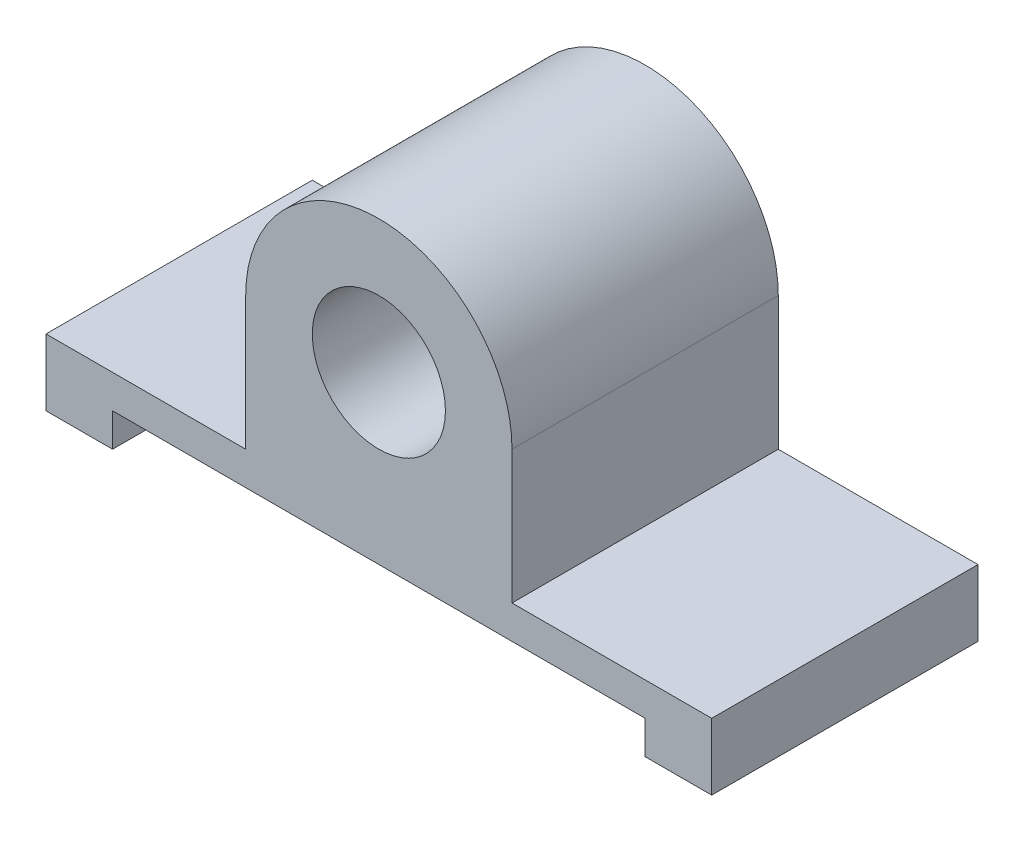
ISO-10303-21;
HEADER;
FILE_DESCRIPTION(('STEP AP214'),'2;1');
FILE_NAME('part.step','',(''),(''),'','','');
FILE_SCHEMA(('AUTOMOTIVE_DESIGN { 1 0 10303 214 1 1 1 1 }'));
ENDSEC;
DATA;
#1=APPLICATION_CONTEXT('core data for automotive mechanical design processes');
#2=APPLICATION_PROTOCOL_DEFINITION('international standard','automotive_design',2000,#1);
#3=PRODUCT_CONTEXT('',#1,'mechanical');
#4=PRODUCT('Part','Part','',(#3));
#5=PRODUCT_RELATED_PRODUCT_CATEGORY('part','',(#4));
#6=PRODUCT_DEFINITION_FORMATION('','',#4);
#7=PRODUCT_DEFINITION_CONTEXT('part definition',#1,'design');
#8=PRODUCT_DEFINITION('design','',#6,#7);
#9=PRODUCT_DEFINITION_SHAPE('','',#8);
#10=(LENGTH_UNIT() NAMED_UNIT(*) SI_UNIT(.MILLI.,.METRE.));
#11=(NAMED_UNIT(*) PLANE_ANGLE_UNIT() SI_UNIT($,.RADIAN.));
#12=(NAMED_UNIT(*) SI_UNIT($,.STERADIAN.) SOLID_ANGLE_UNIT());
#13=UNCERTAINTY_MEASURE_WITH_UNIT(LENGTH_MEASURE(1.E-05),#10,'distance_accuracy_value','');
#14=(GEOMETRIC_REPRESENTATION_CONTEXT(3) GLOBAL_UNCERTAINTY_ASSIGNED_CONTEXT((#13)) GLOBAL_UNIT_ASSIGNED_CONTEXT((#10,
#11,#12)) REPRESENTATION_CONTEXT('',''));
#15=CARTESIAN_POINT('',(0.,0.,0.));
#16=DIRECTION('',(0.,0.,1.));
#17=DIRECTION('',(1.,0.,0.));
#18=AXIS2_PLACEMENT_3D('',#15,#16,#17);
#19=CARTESIAN_POINT('',(0.,30.,20.));
#20=DIRECTION('',(0.,0.,-1.));
#21=DIRECTION('',(-1.,0.,0.));
#22=AXIS2_PLACEMENT_3D('',#19,#20,#21);
#23=PLANE('',#22);
#24=DIRECTION('',(1.,0.,0.));
#25=VECTOR('',#24,1.);
#26=CARTESIAN_POINT('',(40.,0.,20.));
#27=LINE('',#26,#25);
#28=CARTESIAN_POINT('',(40.,0.,20.));
#29=VERTEX_POINT('',#28);
#30=CARTESIAN_POINT('',(50.,0.,20.));
#31=VERTEX_POINT('',#30);
#32=EDGE_CURVE('E183',#29,#31,#27,.T.);
#33=ORIENTED_EDGE('',*,*,#32,.T.);
#34=DIRECTION('',(0.,1.,0.));
#35=VECTOR('',#34,1.);
#36=CARTESIAN_POINT('',(50.,0.,20.));
#37=LINE('',#36,#35);
#38=CARTESIAN_POINT('',(50.,10.,20.));
#39=VERTEX_POINT('',#38);
#40=EDGE_CURVE('E112',#31,#39,#37,.T.);
#41=ORIENTED_EDGE('',*,*,#40,.T.);
#42=DIRECTION('',(-1.,0.,0.));
#43=VECTOR('',#42,1.);
#44=CARTESIAN_POINT('',(50.,10.,20.));
#45=LINE('',#44,#43);
#46=CARTESIAN_POINT('',(20.,10.,20.));
#47=VERTEX_POINT('',#46);
#48=EDGE_CURVE('E210',#39,#47,#45,.T.);
#49=ORIENTED_EDGE('',*,*,#48,.T.);
#50=DIRECTION('',(0.,1.,0.));
#51=VECTOR('',#50,1.);
#52=CARTESIAN_POINT('',(20.,30.,20.));
#53=LINE('',#52,#51);
#54=CARTESIAN_POINT('',(20.,30.,20.));
#55=VERTEX_POINT('',#54);
#56=EDGE_CURVE('E227',#47,#55,#53,.T.);
#57=ORIENTED_EDGE('',*,*,#56,.T.);
#58=CARTESIAN_POINT('',(0.,30.,20.));
#59=DIRECTION('',(0.,0.,1.));
#60=DIRECTION('',(-1.,0.,0.));
#61=AXIS2_PLACEMENT_3D('',#58,#59,#60);
#62=CIRCLE('',#61,20.);
#63=CARTESIAN_POINT('',(-20.,30.,20.));
#64=VERTEX_POINT('',#63);
#65=EDGE_CURVE('E226',#55,#64,#62,.T.);
#66=ORIENTED_EDGE('',*,*,#65,.T.);
#67=DIRECTION('',(0.,-1.,0.));
#68=VECTOR('',#67,1.);
#69=CARTESIAN_POINT('',(-20.,10.,20.));
#70=LINE('',#69,#68);
#71=CARTESIAN_POINT('',(-20.,10.,20.));
#72=VERTEX_POINT('',#71);
#73=EDGE_CURVE('E228',#64,#72,#70,.T.);
#74=ORIENTED_EDGE('',*,*,#73,.T.);
#75=DIRECTION('',(-1.,0.,0.));
#76=VECTOR('',#75,1.);
#77=CARTESIAN_POINT('',(-20.,10.,20.));
#78=LINE('',#77,#76);
#79=CARTESIAN_POINT('',(-50.,10.,20.));
#80=VERTEX_POINT('',#79);
#81=EDGE_CURVE('E231',#72,#80,#78,.T.);
#82=ORIENTED_EDGE('',*,*,#81,.T.);
#83=DIRECTION('',(0.,-1.,0.));
#84=VECTOR('',#83,1.);
#85=CARTESIAN_POINT('',(-50.,10.,20.));
#86=LINE('',#85,#84);
#87=CARTESIAN_POINT('',(-50.,0.,20.));
#88=VERTEX_POINT('',#87);
#89=EDGE_CURVE('E240',#80,#88,#86,.T.);
#90=ORIENTED_EDGE('',*,*,#89,.T.);
#91=DIRECTION('',(1.,0.,0.));
#92=VECTOR('',#91,1.);
#93=CARTESIAN_POINT('',(-50.,0.,20.));
#94=LINE('',#93,#92);
#95=CARTESIAN_POINT('',(-40.,0.,20.));
#96=VERTEX_POINT('',#95);
#97=EDGE_CURVE('E145',#88,#96,#94,.T.);
#98=ORIENTED_EDGE('',*,*,#97,.T.);
#99=DIRECTION('',(0.,1.,0.));
#100=VECTOR('',#99,1.);
#101=CARTESIAN_POINT('',(-40.,0.,20.));
#102=LINE('',#101,#100);
#103=CARTESIAN_POINT('',(-40.,5.00000000000001,20.));
#104=VERTEX_POINT('',#103);
#105=EDGE_CURVE('E136',#96,#104,#102,.T.);
#106=ORIENTED_EDGE('',*,*,#105,.T.);
#107=DIRECTION('',(1.,0.,0.));
#108=VECTOR('',#107,1.);
#109=CARTESIAN_POINT('',(-40.,5.00000000000001,20.));
#110=LINE('',#109,#108);
#111=CARTESIAN_POINT('',(40.,5.00000000000001,20.));
#112=VERTEX_POINT('',#111);
#113=EDGE_CURVE('E139',#104,#112,#110,.T.);
#114=ORIENTED_EDGE('',*,*,#113,.T.);
#115=DIRECTION('',(0.,-1.,0.));
#116=VECTOR('',#115,1.);
#117=CARTESIAN_POINT('',(40.,5.00000000000001,20.));
#118=LINE('',#117,#116);
#119=EDGE_CURVE('E57',#112,#29,#118,.T.);
#120=ORIENTED_EDGE('',*,*,#119,.T.);
#121=EDGE_LOOP('',(#33,#41,#49,#57,#66,#74,#82,#90,#98,#106,#114,#120));
#122=FACE_BOUND('',#121,.T.);
#123=CARTESIAN_POINT('',(0.,30.,20.));
#124=DIRECTION('',(0.,0.,1.));
#125=DIRECTION('',(1.,0.,0.));
#126=AXIS2_PLACEMENT_3D('',#123,#124,#125);
#127=CIRCLE('',#126,10.);
#128=CARTESIAN_POINT('',(9.99999999999999,30.,20.));
#129=VERTEX_POINT('',#128);
#130=EDGE_CURVE('E163',#129,#129,#127,.T.);
#131=ORIENTED_EDGE('',*,*,#130,.F.);
#132=EDGE_LOOP('',(#131));
#133=FACE_BOUND('',#132,.T.);
#134=ADVANCED_FACE('F39',(#122,#133),#23,.F.);
#135=CARTESIAN_POINT('',(0.,30.,-20.));
#136=DIRECTION('',(0.,0.,-1.));
#137=DIRECTION('',(-1.,0.,0.));
#138=AXIS2_PLACEMENT_3D('',#135,#136,#137);
#139=PLANE('',#138);
#140=DIRECTION('',(1.,0.,0.));
#141=VECTOR('',#140,1.);
#142=CARTESIAN_POINT('',(40.,0.,-20.));
#143=LINE('',#142,#141);
#144=CARTESIAN_POINT('',(40.,0.,-20.));
#145=VERTEX_POINT('',#144);
#146=CARTESIAN_POINT('',(50.,0.,-20.));
#147=VERTEX_POINT('',#146);
#148=EDGE_CURVE('E158',#145,#147,#143,.T.);
#149=ORIENTED_EDGE('',*,*,#148,.F.);
#150=DIRECTION('',(0.,-1.,0.));
#151=VECTOR('',#150,1.);
#152=CARTESIAN_POINT('',(40.,5.00000000000001,-20.));
#153=LINE('',#152,#151);
#154=CARTESIAN_POINT('',(40.,5.00000000000001,-20.));
#155=VERTEX_POINT('',#154);
#156=EDGE_CURVE('E104',#155,#145,#153,.T.);
#157=ORIENTED_EDGE('',*,*,#156,.F.);
#158=DIRECTION('',(1.,0.,0.));
#159=VECTOR('',#158,1.);
#160=CARTESIAN_POINT('',(-40.,5.00000000000001,-20.));
#161=LINE('',#160,#159);
#162=CARTESIAN_POINT('',(-40.,5.00000000000001,-20.));
#163=VERTEX_POINT('',#162);
#164=EDGE_CURVE('E100',#163,#155,#161,.T.);
#165=ORIENTED_EDGE('',*,*,#164,.F.);
#166=DIRECTION('',(0.,1.,0.));
#167=VECTOR('',#166,1.);
#168=CARTESIAN_POINT('',(-40.,0.,-20.));
#169=LINE('',#168,#167);
#170=CARTESIAN_POINT('',(-40.,0.,-20.));
#171=VERTEX_POINT('',#170);
#172=EDGE_CURVE('E148',#171,#163,#169,.T.);
#173=ORIENTED_EDGE('',*,*,#172,.F.);
#174=DIRECTION('',(1.,0.,0.));
#175=VECTOR('',#174,1.);
#176=CARTESIAN_POINT('',(-50.,0.,-20.));
#177=LINE('',#176,#175);
#178=CARTESIAN_POINT('',(-50.,0.,-20.));
#179=VERTEX_POINT('',#178);
#180=EDGE_CURVE('E178',#179,#171,#177,.T.);
#181=ORIENTED_EDGE('',*,*,#180,.F.);
#182=DIRECTION('',(0.,-1.,0.));
#183=VECTOR('',#182,1.);
#184=CARTESIAN_POINT('',(-50.,10.,-20.));
#185=LINE('',#184,#183);
#186=CARTESIAN_POINT('',(-50.,10.,-20.));
#187=VERTEX_POINT('',#186);
#188=EDGE_CURVE('E176',#187,#179,#185,.T.);
#189=ORIENTED_EDGE('',*,*,#188,.F.);
#190=DIRECTION('',(-1.,0.,0.));
#191=VECTOR('',#190,1.);
#192=CARTESIAN_POINT('',(-20.,10.,-20.));
#193=LINE('',#192,#191);
#194=CARTESIAN_POINT('',(-20.,10.,-20.));
#195=VERTEX_POINT('',#194);
#196=EDGE_CURVE('E174',#195,#187,#193,.T.);
#197=ORIENTED_EDGE('',*,*,#196,.F.);
#198=DIRECTION('',(0.,-1.,0.));
#199=VECTOR('',#198,1.);
#200=CARTESIAN_POINT('',(-20.,10.,-20.));
#201=LINE('',#200,#199);
#202=CARTESIAN_POINT('',(-20.,30.,-20.));
#203=VERTEX_POINT('',#202);
#204=EDGE_CURVE('E175',#203,#195,#201,.T.);
#205=ORIENTED_EDGE('',*,*,#204,.F.);
#206=CARTESIAN_POINT('',(0.,30.,-20.));
#207=DIRECTION('',(0.,0.,1.));
#208=DIRECTION('',(-1.,0.,0.));
#209=AXIS2_PLACEMENT_3D('',#206,#207,#208);
#210=CIRCLE('',#209,20.);
#211=CARTESIAN_POINT('',(20.,30.,-20.));
#212=VERTEX_POINT('',#211);
#213=EDGE_CURVE('E169',#212,#203,#210,.T.);
#214=ORIENTED_EDGE('',*,*,#213,.F.);
#215=DIRECTION('',(0.,1.,0.));
#216=VECTOR('',#215,1.);
#217=CARTESIAN_POINT('',(20.,30.,-20.));
#218=LINE('',#217,#216);
#219=CARTESIAN_POINT('',(20.,10.,-20.));
#220=VERTEX_POINT('',#219);
#221=EDGE_CURVE('E166',#220,#212,#218,.T.);
#222=ORIENTED_EDGE('',*,*,#221,.F.);
#223=DIRECTION('',(-1.,0.,0.));
#224=VECTOR('',#223,1.);
#225=CARTESIAN_POINT('',(50.,10.,-20.));
#226=LINE('',#225,#224);
#227=CARTESIAN_POINT('',(50.,10.,-20.));
#228=VERTEX_POINT('',#227);
#229=EDGE_CURVE('E168',#228,#220,#226,.T.);
#230=ORIENTED_EDGE('',*,*,#229,.F.);
#231=DIRECTION('',(0.,1.,0.));
#232=VECTOR('',#231,1.);
#233=CARTESIAN_POINT('',(50.,0.,-20.));
#234=LINE('',#233,#232);
#235=EDGE_CURVE('E164',#147,#228,#234,.T.);
#236=ORIENTED_EDGE('',*,*,#235,.F.);
#237=EDGE_LOOP('',(#149,#157,#165,#173,#181,#189,#197,#205,#214,#222,#230,#236));
#238=FACE_BOUND('',#237,.T.);
#239=CARTESIAN_POINT('',(0.,30.,-20.));
#240=DIRECTION('',(0.,0.,1.));
#241=DIRECTION('',(1.,0.,0.));
#242=AXIS2_PLACEMENT_3D('',#239,#240,#241);
#243=CIRCLE('',#242,10.);
#244=CARTESIAN_POINT('',(9.99999999999999,30.,-20.));
#245=VERTEX_POINT('',#244);
#246=EDGE_CURVE('E384',#245,#245,#243,.T.);
#247=ORIENTED_EDGE('',*,*,#246,.T.);
#248=EDGE_LOOP('',(#247));
#249=FACE_BOUND('',#248,.T.);
#250=ADVANCED_FACE('F215',(#238,#249),#139,.T.);
#251=CARTESIAN_POINT('',(40.,0.,20.));
#252=DIRECTION('',(0.,1.,0.));
#253=DIRECTION('',(-1.,0.,0.));
#254=AXIS2_PLACEMENT_3D('',#251,#252,#253);
#255=PLANE('',#254);
#256=ORIENTED_EDGE('',*,*,#148,.T.);
#257=DIRECTION('',(0.,0.,-1.));
#258=VECTOR('',#257,1.);
#259=CARTESIAN_POINT('',(50.,0.,20.));
#260=LINE('',#259,#258);
#261=EDGE_CURVE('E11',#31,#147,#260,.T.);
#262=ORIENTED_EDGE('',*,*,#261,.F.);
#263=ORIENTED_EDGE('',*,*,#32,.F.);
#264=DIRECTION('',(0.,0.,-1.));
#265=VECTOR('',#264,1.);
#266=CARTESIAN_POINT('',(40.,0.,20.));
#267=LINE('',#266,#265);
#268=EDGE_CURVE('E157',#29,#145,#267,.T.);
#269=ORIENTED_EDGE('',*,*,#268,.T.);
#270=EDGE_LOOP('',(#256,#262,#263,#269));
#271=FACE_BOUND('',#270,.T.);
#272=ADVANCED_FACE('F41',(#271),#255,.F.);
#273=CARTESIAN_POINT('',(50.,0.,20.));
#274=DIRECTION('',(-1.,0.,0.));
#275=DIRECTION('',(0.,0.,1.));
#276=AXIS2_PLACEMENT_3D('',#273,#274,#275);
#277=PLANE('',#276);
#278=ORIENTED_EDGE('',*,*,#235,.T.);
#279=DIRECTION('',(0.,0.,-1.));
#280=VECTOR('',#279,1.);
#281=CARTESIAN_POINT('',(50.,10.,20.));
#282=LINE('',#281,#280);
#283=EDGE_CURVE('E48',#39,#228,#282,.T.);
#284=ORIENTED_EDGE('',*,*,#283,.F.);
#285=ORIENTED_EDGE('',*,*,#40,.F.);
#286=ORIENTED_EDGE('',*,*,#261,.T.);
#287=EDGE_LOOP('',(#278,#284,#285,#286));
#288=FACE_BOUND('',#287,.T.);
#289=ADVANCED_FACE('F271',(#288),#277,.F.);
#290=CARTESIAN_POINT('',(50.,10.,20.));
#291=DIRECTION('',(0.,-1.,0.));
#292=DIRECTION('',(1.,0.,0.));
#293=AXIS2_PLACEMENT_3D('',#290,#291,#292);
#294=PLANE('',#293);
#295=ORIENTED_EDGE('',*,*,#229,.T.);
#296=DIRECTION('',(0.,0.,-1.));
#297=VECTOR('',#296,1.);
#298=CARTESIAN_POINT('',(20.,10.,20.));
#299=LINE('',#298,#297);
#300=EDGE_CURVE('E205',#47,#220,#299,.T.);
#301=ORIENTED_EDGE('',*,*,#300,.F.);
#302=ORIENTED_EDGE('',*,*,#48,.F.);
#303=ORIENTED_EDGE('',*,*,#283,.T.);
#304=EDGE_LOOP('',(#295,#301,#302,#303));
#305=FACE_BOUND('',#304,.T.);
#306=ADVANCED_FACE('F209',(#305),#294,.F.);
#307=CARTESIAN_POINT('',(20.,30.,20.));
#308=DIRECTION('',(-1.,0.,0.));
#309=DIRECTION('',(0.,-1.,0.));
#310=AXIS2_PLACEMENT_3D('',#307,#308,#309);
#311=PLANE('',#310);
#312=ORIENTED_EDGE('',*,*,#221,.T.);
#313=DIRECTION('',(0.,0.,-1.));
#314=VECTOR('',#313,1.);
#315=CARTESIAN_POINT('',(20.,30.,20.));
#316=LINE('',#315,#314);
#317=EDGE_CURVE('E198',#55,#212,#316,.T.);
#318=ORIENTED_EDGE('',*,*,#317,.F.);
#319=ORIENTED_EDGE('',*,*,#56,.F.);
#320=ORIENTED_EDGE('',*,*,#300,.T.);
#321=EDGE_LOOP('',(#312,#318,#319,#320));
#322=FACE_BOUND('',#321,.T.);
#323=ADVANCED_FACE('F217',(#322),#311,.F.);
#324=CARTESIAN_POINT('',(0.,30.,20.));
#325=DIRECTION('',(0.,0.,-1.));
#326=DIRECTION('',(-1.,0.,0.));
#327=AXIS2_PLACEMENT_3D('',#324,#325,#326);
#328=CYLINDRICAL_SURFACE('',#327,20.);
#329=ORIENTED_EDGE('',*,*,#213,.T.);
#330=DIRECTION('',(0.,0.,-1.));
#331=VECTOR('',#330,1.);
#332=CARTESIAN_POINT('',(-20.,30.,20.));
#333=LINE('',#332,#331);
#334=EDGE_CURVE('E196',#64,#203,#333,.T.);
#335=ORIENTED_EDGE('',*,*,#334,.F.);
#336=ORIENTED_EDGE('',*,*,#65,.F.);
#337=ORIENTED_EDGE('',*,*,#317,.T.);
#338=EDGE_LOOP('',(#329,#335,#336,#337));
#339=FACE_BOUND('',#338,.T.);
#340=ADVANCED_FACE('F222',(#339),#328,.T.);
#341=CARTESIAN_POINT('',(-20.,10.,20.));
#342=DIRECTION('',(1.,0.,0.));
#343=DIRECTION('',(0.,0.,-1.));
#344=AXIS2_PLACEMENT_3D('',#341,#342,#343);
#345=PLANE('',#344);
#346=ORIENTED_EDGE('',*,*,#204,.T.);
#347=DIRECTION('',(0.,0.,-1.));
#348=VECTOR('',#347,1.);
#349=CARTESIAN_POINT('',(-20.,10.,20.));
#350=LINE('',#349,#348);
#351=EDGE_CURVE('E194',#72,#195,#350,.T.);
#352=ORIENTED_EDGE('',*,*,#351,.F.);
#353=ORIENTED_EDGE('',*,*,#73,.F.);
#354=ORIENTED_EDGE('',*,*,#334,.T.);
#355=EDGE_LOOP('',(#346,#352,#353,#354));
#356=FACE_BOUND('',#355,.T.);
#357=ADVANCED_FACE('F281',(#356),#345,.F.);
#358=CARTESIAN_POINT('',(-20.,10.,20.));
#359=DIRECTION('',(0.,-1.,0.));
#360=DIRECTION('',(1.,0.,0.));
#361=AXIS2_PLACEMENT_3D('',#358,#359,#360);
#362=PLANE('',#361);
#363=ORIENTED_EDGE('',*,*,#196,.T.);
#364=DIRECTION('',(0.,0.,-1.));
#365=VECTOR('',#364,1.);
#366=CARTESIAN_POINT('',(-50.,10.,20.));
#367=LINE('',#366,#365);
#368=EDGE_CURVE('E189',#80,#187,#367,.T.);
#369=ORIENTED_EDGE('',*,*,#368,.F.);
#370=ORIENTED_EDGE('',*,*,#81,.F.);
#371=ORIENTED_EDGE('',*,*,#351,.T.);
#372=EDGE_LOOP('',(#363,#369,#370,#371));
#373=FACE_BOUND('',#372,.T.);
#374=ADVANCED_FACE('F287',(#373),#362,.F.);
#375=CARTESIAN_POINT('',(-50.,10.,20.));
#376=DIRECTION('',(1.,0.,0.));
#377=DIRECTION('',(0.,0.,-1.));
#378=AXIS2_PLACEMENT_3D('',#375,#376,#377);
#379=PLANE('',#378);
#380=ORIENTED_EDGE('',*,*,#188,.T.);
#381=DIRECTION('',(0.,0.,-1.));
#382=VECTOR('',#381,1.);
#383=CARTESIAN_POINT('',(-50.,0.,20.));
#384=LINE('',#383,#382);
#385=EDGE_CURVE('E190',#88,#179,#384,.T.);
#386=ORIENTED_EDGE('',*,*,#385,.F.);
#387=ORIENTED_EDGE('',*,*,#89,.F.);
#388=ORIENTED_EDGE('',*,*,#368,.T.);
#389=EDGE_LOOP('',(#380,#386,#387,#388));
#390=FACE_BOUND('',#389,.T.);
#391=ADVANCED_FACE('F244',(#390),#379,.F.);
#392=CARTESIAN_POINT('',(-50.,0.,20.));
#393=DIRECTION('',(0.,1.,0.));
#394=DIRECTION('',(0.,0.,1.));
#395=AXIS2_PLACEMENT_3D('',#392,#393,#394);
#396=PLANE('',#395);
#397=ORIENTED_EDGE('',*,*,#180,.T.);
#398=DIRECTION('',(0.,0.,-1.));
#399=VECTOR('',#398,1.);
#400=CARTESIAN_POINT('',(-40.,0.,20.));
#401=LINE('',#400,#399);
#402=EDGE_CURVE('E151',#96,#171,#401,.T.);
#403=ORIENTED_EDGE('',*,*,#402,.F.);
#404=ORIENTED_EDGE('',*,*,#97,.F.);
#405=ORIENTED_EDGE('',*,*,#385,.T.);
#406=EDGE_LOOP('',(#397,#403,#404,#405));
#407=FACE_BOUND('',#406,.T.);
#408=ADVANCED_FACE('F250',(#407),#396,.F.);
#409=CARTESIAN_POINT('',(-40.,0.,20.));
#410=DIRECTION('',(-1.,0.,0.));
#411=DIRECTION('',(0.,-1.,0.));
#412=AXIS2_PLACEMENT_3D('',#409,#410,#411);
#413=PLANE('',#412);
#414=ORIENTED_EDGE('',*,*,#172,.T.);
#415=DIRECTION('',(0.,0.,-1.));
#416=VECTOR('',#415,1.);
#417=CARTESIAN_POINT('',(-40.,5.00000000000001,20.));
#418=LINE('',#417,#416);
#419=EDGE_CURVE('E150',#104,#163,#418,.T.);
#420=ORIENTED_EDGE('',*,*,#419,.F.);
#421=ORIENTED_EDGE('',*,*,#105,.F.);
#422=ORIENTED_EDGE('',*,*,#402,.T.);
#423=EDGE_LOOP('',(#414,#420,#421,#422));
#424=FACE_BOUND('',#423,.T.);
#425=ADVANCED_FACE('F149',(#424),#413,.F.);
#426=CARTESIAN_POINT('',(-40.,5.00000000000001,20.));
#427=DIRECTION('',(0.,1.,0.));
#428=DIRECTION('',(0.,0.,1.));
#429=AXIS2_PLACEMENT_3D('',#426,#427,#428);
#430=PLANE('',#429);
#431=ORIENTED_EDGE('',*,*,#164,.T.);
#432=DIRECTION('',(0.,0.,-1.));
#433=VECTOR('',#432,1.);
#434=CARTESIAN_POINT('',(40.,5.00000000000001,20.));
#435=LINE('',#434,#433);
#436=EDGE_CURVE('E152',#112,#155,#435,.T.);
#437=ORIENTED_EDGE('',*,*,#436,.F.);
#438=ORIENTED_EDGE('',*,*,#113,.F.);
#439=ORIENTED_EDGE('',*,*,#419,.T.);
#440=EDGE_LOOP('',(#431,#437,#438,#439));
#441=FACE_BOUND('',#440,.T.);
#442=ADVANCED_FACE('F153',(#441),#430,.F.);
#443=CARTESIAN_POINT('',(40.,5.00000000000001,20.));
#444=DIRECTION('',(1.,0.,0.));
#445=DIRECTION('',(0.,1.,0.));
#446=AXIS2_PLACEMENT_3D('',#443,#444,#445);
#447=PLANE('',#446);
#448=ORIENTED_EDGE('',*,*,#156,.T.);
#449=ORIENTED_EDGE('',*,*,#268,.F.);
#450=ORIENTED_EDGE('',*,*,#119,.F.);
#451=ORIENTED_EDGE('',*,*,#436,.T.);
#452=EDGE_LOOP('',(#448,#449,#450,#451));
#453=FACE_BOUND('',#452,.T.);
#454=ADVANCED_FACE('F251',(#453),#447,.F.);
#455=CARTESIAN_POINT('',(0.,30.,20.));
#456=DIRECTION('',(0.,0.,-1.));
#457=DIRECTION('',(-1.,0.,0.));
#458=AXIS2_PLACEMENT_3D('',#455,#456,#457);
#459=CYLINDRICAL_SURFACE('',#458,10.);
#460=ORIENTED_EDGE('',*,*,#130,.T.);
#461=EDGE_LOOP('',(#460));
#462=FACE_BOUND('',#461,.T.);
#463=ORIENTED_EDGE('',*,*,#246,.F.);
#464=EDGE_LOOP('',(#463));
#465=FACE_BOUND('',#464,.T.);
#466=ADVANCED_FACE('F254',(#462,#465),#459,.F.);
#467=CLOSED_SHELL('',(#134,#250,#272,#289,#306,#323,#340,#357,#374,#391,#408,#425,#442,#454,#466));
#468=MANIFOLD_SOLID_BREP('B2',#467);
#469=ADVANCED_BREP_SHAPE_REPRESENTATION('',(#18,#468),#14);
#470=SHAPE_DEFINITION_REPRESENTATION(#9,#469);
ENDSEC;
END-ISO-10303-21;
